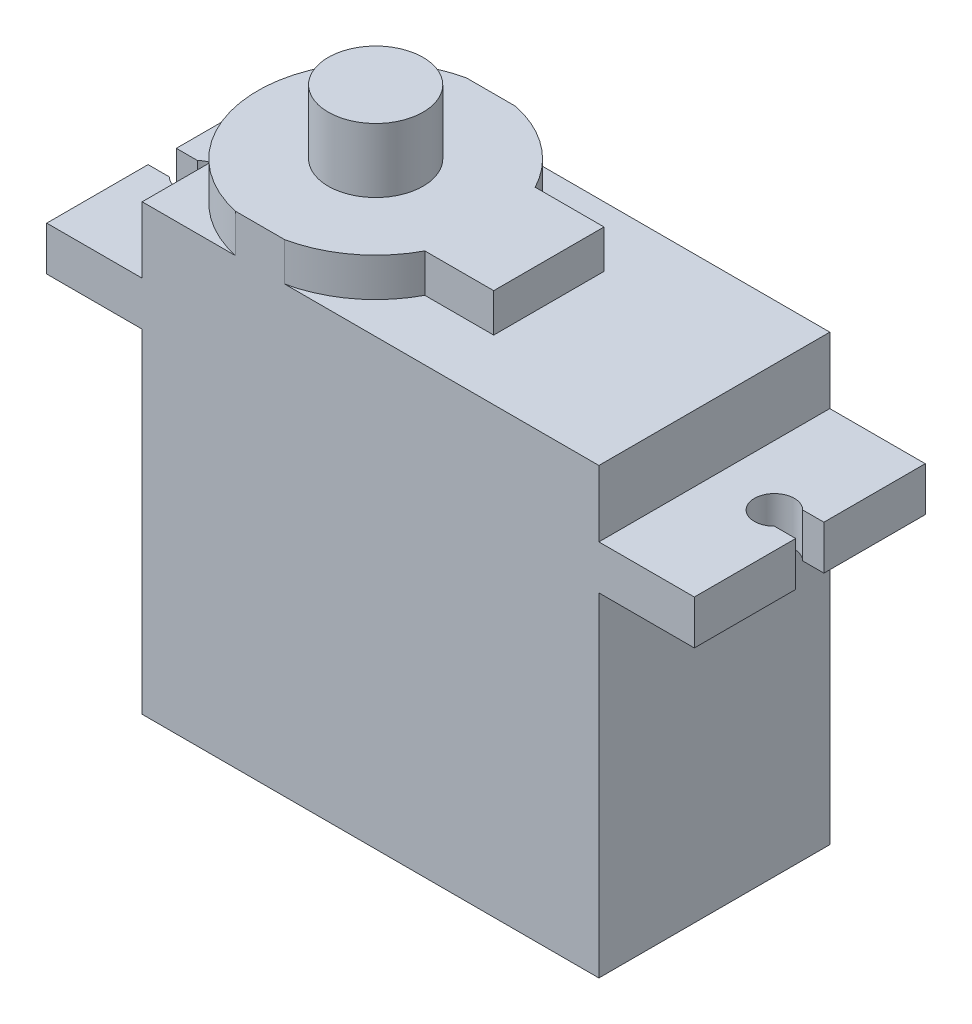
ISO-10303-21;
HEADER;
FILE_DESCRIPTION(('STEP AP214'),'2;1');
FILE_NAME('part.step','',(''),(''),'','','');
FILE_SCHEMA(('AUTOMOTIVE_DESIGN { 1 0 10303 214 1 1 1 1 }'));
ENDSEC;
DATA;
#1=APPLICATION_CONTEXT('core data for automotive mechanical design processes');
#2=APPLICATION_PROTOCOL_DEFINITION('international standard','automotive_design',2000,#1);
#3=PRODUCT_CONTEXT('',#1,'mechanical');
#4=PRODUCT('Part','Part','',(#3));
#5=PRODUCT_RELATED_PRODUCT_CATEGORY('part','',(#4));
#6=PRODUCT_DEFINITION_FORMATION('','',#4);
#7=PRODUCT_DEFINITION_CONTEXT('part definition',#1,'design');
#8=PRODUCT_DEFINITION('design','',#6,#7);
#9=PRODUCT_DEFINITION_SHAPE('','',#8);
#10=(LENGTH_UNIT() NAMED_UNIT(*) SI_UNIT(.MILLI.,.METRE.));
#11=(NAMED_UNIT(*) PLANE_ANGLE_UNIT() SI_UNIT($,.RADIAN.));
#12=(NAMED_UNIT(*) SI_UNIT($,.STERADIAN.) SOLID_ANGLE_UNIT());
#13=UNCERTAINTY_MEASURE_WITH_UNIT(LENGTH_MEASURE(1.E-05),#10,'distance_accuracy_value','');
#14=(GEOMETRIC_REPRESENTATION_CONTEXT(3) GLOBAL_UNCERTAINTY_ASSIGNED_CONTEXT((#13)) GLOBAL_UNIT_ASSIGNED_CONTEXT((#10,
#11,#12)) REPRESENTATION_CONTEXT('',''));
#15=CARTESIAN_POINT('',(0.,0.,0.));
#16=DIRECTION('',(0.,0.,1.));
#17=DIRECTION('',(1.,0.,0.));
#18=AXIS2_PLACEMENT_3D('',#15,#16,#17);
#19=CARTESIAN_POINT('',(22.606,21.971,0.));
#20=DIRECTION('',(-1.,0.,0.));
#21=DIRECTION('',(0.,0.,1.));
#22=AXIS2_PLACEMENT_3D('',#19,#20,#21);
#23=PLANE('',#22);
#24=DIRECTION('',(0.,0.,-1.));
#25=VECTOR('',#24,1.);
#26=CARTESIAN_POINT('',(22.606,16.51,0.));
#27=LINE('',#26,#25);
#28=CARTESIAN_POINT('',(22.606,16.51,0.));
#29=VERTEX_POINT('',#28);
#30=CARTESIAN_POINT('',(22.606,16.51,-11.43));
#31=VERTEX_POINT('',#30);
#32=EDGE_CURVE('E419',#29,#31,#27,.T.);
#33=ORIENTED_EDGE('',*,*,#32,.F.);
#34=DIRECTION('',(0.,-1.,0.));
#35=VECTOR('',#34,1.);
#36=CARTESIAN_POINT('',(22.606,21.971,0.));
#37=LINE('',#36,#35);
#38=CARTESIAN_POINT('',(22.606,0.,0.));
#39=VERTEX_POINT('',#38);
#40=EDGE_CURVE('E251',#29,#39,#37,.T.);
#41=ORIENTED_EDGE('',*,*,#40,.T.);
#42=DIRECTION('',(0.,0.,-1.));
#43=VECTOR('',#42,1.);
#44=CARTESIAN_POINT('',(22.606,0.,0.));
#45=LINE('',#44,#43);
#46=CARTESIAN_POINT('',(22.606,0.,-11.43));
#47=VERTEX_POINT('',#46);
#48=EDGE_CURVE('E282',#39,#47,#45,.T.);
#49=ORIENTED_EDGE('',*,*,#48,.T.);
#50=DIRECTION('',(0.,-1.,0.));
#51=VECTOR('',#50,1.);
#52=CARTESIAN_POINT('',(22.606,21.971,-11.43));
#53=LINE('',#52,#51);
#54=EDGE_CURVE('E258',#31,#47,#53,.T.);
#55=ORIENTED_EDGE('',*,*,#54,.F.);
#56=EDGE_LOOP('',(#33,#41,#49,#55));
#57=FACE_BOUND('',#56,.T.);
#58=ADVANCED_FACE('F36',(#57),#23,.F.);
#59=CARTESIAN_POINT('',(5.842,23.876,-5.715));
#60=DIRECTION('',(0.,1.,0.));
#61=DIRECTION('',(0.,0.,1.));
#62=AXIS2_PLACEMENT_3D('',#59,#60,#61);
#63=PLANE('',#62);
#64=CARTESIAN_POINT('',(5.842,23.876,-5.715));
#65=DIRECTION('',(0.,1.,0.));
#66=DIRECTION('',(0.,0.,1.));
#67=AXIS2_PLACEMENT_3D('',#64,#65,#66);
#68=CIRCLE('',#67,5.842);
#69=CARTESIAN_POINT('',(4.63049721420047,23.876,-11.43));
#70=VERTEX_POINT('',#69);
#71=CARTESIAN_POINT('',(4.63049721420046,23.876,0.));
#72=VERTEX_POINT('',#71);
#73=EDGE_CURVE('E466',#70,#72,#68,.T.);
#74=ORIENTED_EDGE('',*,*,#73,.T.);
#75=DIRECTION('',(1.,0.,0.));
#76=VECTOR('',#75,1.);
#77=CARTESIAN_POINT('',(4.63049721420046,23.876,0.));
#78=LINE('',#77,#76);
#79=CARTESIAN_POINT('',(7.05350278579953,23.876,0.));
#80=VERTEX_POINT('',#79);
#81=EDGE_CURVE('E469',#72,#80,#78,.T.);
#82=ORIENTED_EDGE('',*,*,#81,.T.);
#83=CARTESIAN_POINT('',(5.842,23.876,-5.715));
#84=DIRECTION('',(0.,1.,0.));
#85=DIRECTION('',(0.,0.,1.));
#86=AXIS2_PLACEMENT_3D('',#83,#84,#85);
#87=CIRCLE('',#86,5.842);
#88=CARTESIAN_POINT('',(11.0066232921676,23.876,-2.9845));
#89=VERTEX_POINT('',#88);
#90=EDGE_CURVE('E471',#80,#89,#87,.T.);
#91=ORIENTED_EDGE('',*,*,#90,.T.);
#92=DIRECTION('',(1.,0.,0.));
#93=VECTOR('',#92,1.);
#94=CARTESIAN_POINT('',(11.0066232921676,23.876,-2.9845));
#95=LINE('',#94,#93);
#96=CARTESIAN_POINT('',(14.4145,23.876,-2.9845));
#97=VERTEX_POINT('',#96);
#98=EDGE_CURVE('E473',#89,#97,#95,.T.);
#99=ORIENTED_EDGE('',*,*,#98,.T.);
#100=DIRECTION('',(0.,0.,-1.));
#101=VECTOR('',#100,1.);
#102=CARTESIAN_POINT('',(14.4145,23.876,-2.9845));
#103=LINE('',#102,#101);
#104=CARTESIAN_POINT('',(14.4145,23.876,-8.4455));
#105=VERTEX_POINT('',#104);
#106=EDGE_CURVE('E475',#97,#105,#103,.T.);
#107=ORIENTED_EDGE('',*,*,#106,.T.);
#108=DIRECTION('',(-1.,0.,0.));
#109=VECTOR('',#108,1.);
#110=CARTESIAN_POINT('',(11.0066232921676,23.876,-8.4455));
#111=LINE('',#110,#109);
#112=CARTESIAN_POINT('',(11.0066232921676,23.876,-8.4455));
#113=VERTEX_POINT('',#112);
#114=EDGE_CURVE('E477',#105,#113,#111,.T.);
#115=ORIENTED_EDGE('',*,*,#114,.T.);
#116=CARTESIAN_POINT('',(5.842,23.876,-5.715));
#117=DIRECTION('',(0.,1.,0.));
#118=DIRECTION('',(0.,0.,1.));
#119=AXIS2_PLACEMENT_3D('',#116,#117,#118);
#120=CIRCLE('',#119,5.842);
#121=CARTESIAN_POINT('',(7.05350278579953,23.876,-11.43));
#122=VERTEX_POINT('',#121);
#123=EDGE_CURVE('E479',#113,#122,#120,.T.);
#124=ORIENTED_EDGE('',*,*,#123,.T.);
#125=DIRECTION('',(-1.,0.,0.));
#126=VECTOR('',#125,1.);
#127=CARTESIAN_POINT('',(4.63049721420047,23.876,-11.43));
#128=LINE('',#127,#126);
#129=EDGE_CURVE('E481',#122,#70,#128,.T.);
#130=ORIENTED_EDGE('',*,*,#129,.T.);
#131=EDGE_LOOP('',(#74,#82,#91,#99,#107,#115,#124,#130));
#132=FACE_BOUND('',#131,.T.);
#133=CARTESIAN_POINT('',(5.842,23.876,-5.715));
#134=DIRECTION('',(0.,1.,0.));
#135=DIRECTION('',(0.,0.,1.));
#136=AXIS2_PLACEMENT_3D('',#133,#134,#135);
#137=CIRCLE('',#136,2.3495);
#138=CARTESIAN_POINT('',(5.842,23.876,-3.3655));
#139=VERTEX_POINT('',#138);
#140=EDGE_CURVE('E459',#139,#139,#137,.T.);
#141=ORIENTED_EDGE('',*,*,#140,.F.);
#142=EDGE_LOOP('',(#141));
#143=FACE_BOUND('',#142,.T.);
#144=ADVANCED_FACE('F550',(#132,#143),#63,.T.);
#145=CARTESIAN_POINT('',(0.,21.971,0.));
#146=DIRECTION('',(0.,-1.,0.));
#147=DIRECTION('',(0.,0.,-1.));
#148=AXIS2_PLACEMENT_3D('',#145,#146,#147);
#149=PLANE('',#148);
#150=CARTESIAN_POINT('',(5.842,21.971,-5.715));
#151=DIRECTION('',(0.,1.,0.));
#152=DIRECTION('',(0.,0.,1.));
#153=AXIS2_PLACEMENT_3D('',#150,#151,#152);
#154=CIRCLE('',#153,5.842);
#155=CARTESIAN_POINT('',(4.63049721420047,21.971,-11.43));
#156=VERTEX_POINT('',#155);
#157=CARTESIAN_POINT('',(0.,21.971,-5.715));
#158=VERTEX_POINT('',#157);
#159=EDGE_CURVE('E463',#156,#158,#154,.T.);
#160=ORIENTED_EDGE('',*,*,#159,.F.);
#161=DIRECTION('',(-1.,0.,0.));
#162=VECTOR('',#161,1.);
#163=CARTESIAN_POINT('',(0.,21.971,-11.43));
#164=LINE('',#163,#162);
#165=CARTESIAN_POINT('',(0.,21.971,-11.43));
#166=VERTEX_POINT('',#165);
#167=EDGE_CURVE('E296',#156,#166,#164,.T.);
#168=ORIENTED_EDGE('',*,*,#167,.T.);
#169=DIRECTION('',(0.,0.,1.));
#170=VECTOR('',#169,1.);
#171=CARTESIAN_POINT('',(0.,21.971,0.));
#172=LINE('',#171,#170);
#173=EDGE_CURVE('E303',#166,#158,#172,.T.);
#174=ORIENTED_EDGE('',*,*,#173,.T.);
#175=EDGE_LOOP('',(#160,#168,#174));
#176=FACE_BOUND('',#175,.T.);
#177=ADVANCED_FACE('F569',(#176),#149,.F.);
#178=CARTESIAN_POINT('',(4.63049721420047,21.971,0.));
#179=VERTEX_POINT('',#178);
#180=EDGE_CURVE('E11',#158,#179,#154,.T.);
#181=ORIENTED_EDGE('',*,*,#180,.F.);
#182=CARTESIAN_POINT('',(0.,21.971,0.));
#183=VERTEX_POINT('',#182);
#184=EDGE_CURVE('E281',#158,#183,#172,.T.);
#185=ORIENTED_EDGE('',*,*,#184,.T.);
#186=DIRECTION('',(1.,0.,0.));
#187=VECTOR('',#186,1.);
#188=CARTESIAN_POINT('',(0.,21.971,0.));
#189=LINE('',#188,#187);
#190=EDGE_CURVE('E302',#183,#179,#189,.T.);
#191=ORIENTED_EDGE('',*,*,#190,.T.);
#192=EDGE_LOOP('',(#181,#185,#191));
#193=FACE_BOUND('',#192,.T.);
#194=ADVANCED_FACE('F589',(#193),#149,.F.);
#195=CARTESIAN_POINT('',(5.842,21.971,-5.715));
#196=DIRECTION('',(0.,1.,0.));
#197=DIRECTION('',(0.,0.,1.));
#198=AXIS2_PLACEMENT_3D('',#195,#196,#197);
#199=CIRCLE('',#198,5.842);
#200=CARTESIAN_POINT('',(11.0066232921676,21.971,-8.4455));
#201=VERTEX_POINT('',#200);
#202=CARTESIAN_POINT('',(7.05350278579952,21.971,-11.43));
#203=VERTEX_POINT('',#202);
#204=EDGE_CURVE('E61',#201,#203,#199,.T.);
#205=ORIENTED_EDGE('',*,*,#204,.F.);
#206=DIRECTION('',(-1.,0.,0.));
#207=VECTOR('',#206,1.);
#208=CARTESIAN_POINT('',(11.0066232921676,21.971,-8.4455));
#209=LINE('',#208,#207);
#210=CARTESIAN_POINT('',(14.4145,21.971,-8.4455));
#211=VERTEX_POINT('',#210);
#212=EDGE_CURVE('E504',#211,#201,#209,.T.);
#213=ORIENTED_EDGE('',*,*,#212,.F.);
#214=DIRECTION('',(0.,0.,-1.));
#215=VECTOR('',#214,1.);
#216=CARTESIAN_POINT('',(14.4145,21.971,-2.9845));
#217=LINE('',#216,#215);
#218=CARTESIAN_POINT('',(14.4145,21.971,-2.9845));
#219=VERTEX_POINT('',#218);
#220=EDGE_CURVE('E537',#219,#211,#217,.T.);
#221=ORIENTED_EDGE('',*,*,#220,.F.);
#222=DIRECTION('',(1.,0.,0.));
#223=VECTOR('',#222,1.);
#224=CARTESIAN_POINT('',(11.0066232921676,21.971,-2.9845));
#225=LINE('',#224,#223);
#226=CARTESIAN_POINT('',(11.0066232921676,21.971,-2.9845));
#227=VERTEX_POINT('',#226);
#228=EDGE_CURVE('E486',#227,#219,#225,.T.);
#229=ORIENTED_EDGE('',*,*,#228,.F.);
#230=CARTESIAN_POINT('',(5.842,21.971,-5.715));
#231=DIRECTION('',(0.,1.,0.));
#232=DIRECTION('',(0.,0.,1.));
#233=AXIS2_PLACEMENT_3D('',#230,#231,#232);
#234=CIRCLE('',#233,5.842);
#235=CARTESIAN_POINT('',(7.05350278579952,21.971,0.));
#236=VERTEX_POINT('',#235);
#237=EDGE_CURVE('E494',#236,#227,#234,.T.);
#238=ORIENTED_EDGE('',*,*,#237,.F.);
#239=CARTESIAN_POINT('',(22.606,21.971,0.));
#240=VERTEX_POINT('',#239);
#241=EDGE_CURVE('E300',#236,#240,#189,.T.);
#242=ORIENTED_EDGE('',*,*,#241,.T.);
#243=DIRECTION('',(0.,0.,-1.));
#244=VECTOR('',#243,1.);
#245=CARTESIAN_POINT('',(22.606,21.971,0.));
#246=LINE('',#245,#244);
#247=CARTESIAN_POINT('',(22.606,21.971,-11.43));
#248=VERTEX_POINT('',#247);
#249=EDGE_CURVE('E249',#240,#248,#246,.T.);
#250=ORIENTED_EDGE('',*,*,#249,.T.);
#251=EDGE_CURVE('E298',#248,#203,#164,.T.);
#252=ORIENTED_EDGE('',*,*,#251,.T.);
#253=EDGE_LOOP('',(#205,#213,#221,#229,#238,#242,#250,#252));
#254=FACE_BOUND('',#253,.T.);
#255=ADVANCED_FACE('F584',(#254),#149,.F.);
#256=CARTESIAN_POINT('',(0.,21.971,0.));
#257=DIRECTION('',(1.,0.,0.));
#258=DIRECTION('',(0.,0.,-1.));
#259=AXIS2_PLACEMENT_3D('',#256,#257,#258);
#260=PLANE('',#259);
#261=DIRECTION('',(0.,0.,-1.));
#262=VECTOR('',#261,1.);
#263=CARTESIAN_POINT('',(0.,18.6944,0.));
#264=LINE('',#263,#262);
#265=CARTESIAN_POINT('',(0.,18.6944,0.));
#266=VERTEX_POINT('',#265);
#267=CARTESIAN_POINT('',(0.,18.6944,-11.43));
#268=VERTEX_POINT('',#267);
#269=EDGE_CURVE('E393',#266,#268,#264,.T.);
#270=ORIENTED_EDGE('',*,*,#269,.F.);
#271=DIRECTION('',(0.,-1.,0.));
#272=VECTOR('',#271,1.);
#273=CARTESIAN_POINT('',(0.,21.971,0.));
#274=LINE('',#273,#272);
#275=EDGE_CURVE('E45',#183,#266,#274,.T.);
#276=ORIENTED_EDGE('',*,*,#275,.F.);
#277=ORIENTED_EDGE('',*,*,#184,.F.);
#278=ORIENTED_EDGE('',*,*,#173,.F.);
#279=DIRECTION('',(0.,-1.,0.));
#280=VECTOR('',#279,1.);
#281=CARTESIAN_POINT('',(0.,21.971,-11.43));
#282=LINE('',#281,#280);
#283=EDGE_CURVE('E271',#166,#268,#282,.T.);
#284=ORIENTED_EDGE('',*,*,#283,.T.);
#285=EDGE_LOOP('',(#270,#276,#277,#278,#284));
#286=FACE_BOUND('',#285,.T.);
#287=ADVANCED_FACE('F580',(#286),#260,.F.);
#288=CARTESIAN_POINT('',(0.,16.51,0.));
#289=VERTEX_POINT('',#288);
#290=CARTESIAN_POINT('',(0.,0.,0.));
#291=VERTEX_POINT('',#290);
#292=EDGE_CURVE('E250',#289,#291,#274,.T.);
#293=ORIENTED_EDGE('',*,*,#292,.F.);
#294=DIRECTION('',(0.,0.,-1.));
#295=VECTOR('',#294,1.);
#296=CARTESIAN_POINT('',(0.,16.51,0.));
#297=LINE('',#296,#295);
#298=CARTESIAN_POINT('',(0.,16.51,-11.43));
#299=VERTEX_POINT('',#298);
#300=EDGE_CURVE('E345',#289,#299,#297,.T.);
#301=ORIENTED_EDGE('',*,*,#300,.T.);
#302=CARTESIAN_POINT('',(0.,0.,-11.43));
#303=VERTEX_POINT('',#302);
#304=EDGE_CURVE('E273',#299,#303,#282,.T.);
#305=ORIENTED_EDGE('',*,*,#304,.T.);
#306=DIRECTION('',(0.,0.,1.));
#307=VECTOR('',#306,1.);
#308=CARTESIAN_POINT('',(0.,0.,0.));
#309=LINE('',#308,#307);
#310=EDGE_CURVE('E287',#303,#291,#309,.T.);
#311=ORIENTED_EDGE('',*,*,#310,.T.);
#312=EDGE_LOOP('',(#293,#301,#305,#311));
#313=FACE_BOUND('',#312,.T.);
#314=ADVANCED_FACE('F38',(#313),#260,.F.);
#315=CARTESIAN_POINT('',(0.,21.971,0.));
#316=DIRECTION('',(0.,0.,-1.));
#317=DIRECTION('',(-1.,0.,0.));
#318=AXIS2_PLACEMENT_3D('',#315,#316,#317);
#319=PLANE('',#318);
#320=DIRECTION('',(1.,0.,0.));
#321=VECTOR('',#320,1.);
#322=CARTESIAN_POINT('',(0.,0.,0.));
#323=LINE('',#322,#321);
#324=EDGE_CURVE('E285',#291,#39,#323,.T.);
#325=ORIENTED_EDGE('',*,*,#324,.T.);
#326=ORIENTED_EDGE('',*,*,#40,.F.);
#327=DIRECTION('',(-1.,0.,0.));
#328=VECTOR('',#327,1.);
#329=CARTESIAN_POINT('',(22.606,16.51,0.));
#330=LINE('',#329,#328);
#331=CARTESIAN_POINT('',(27.3304,16.51,0.));
#332=VERTEX_POINT('',#331);
#333=EDGE_CURVE('E414',#332,#29,#330,.T.);
#334=ORIENTED_EDGE('',*,*,#333,.F.);
#335=DIRECTION('',(0.,-1.,0.));
#336=VECTOR('',#335,1.);
#337=CARTESIAN_POINT('',(27.3304,18.6944,0.));
#338=LINE('',#337,#336);
#339=CARTESIAN_POINT('',(27.3304,18.6944,0.));
#340=VERTEX_POINT('',#339);
#341=EDGE_CURVE('E245',#340,#332,#338,.T.);
#342=ORIENTED_EDGE('',*,*,#341,.F.);
#343=DIRECTION('',(-1.,0.,0.));
#344=VECTOR('',#343,1.);
#345=CARTESIAN_POINT('',(22.606,18.6944,0.));
#346=LINE('',#345,#344);
#347=CARTESIAN_POINT('',(22.606,18.6944,0.));
#348=VERTEX_POINT('',#347);
#349=EDGE_CURVE('E229',#340,#348,#346,.T.);
#350=ORIENTED_EDGE('',*,*,#349,.T.);
#351=EDGE_CURVE('E242',#240,#348,#37,.T.);
#352=ORIENTED_EDGE('',*,*,#351,.F.);
#353=ORIENTED_EDGE('',*,*,#241,.F.);
#354=DIRECTION('',(0.,-1.,0.));
#355=VECTOR('',#354,1.);
#356=CARTESIAN_POINT('',(7.05350278579953,23.876,0.));
#357=LINE('',#356,#355);
#358=EDGE_CURVE('E521',#80,#236,#357,.T.);
#359=ORIENTED_EDGE('',*,*,#358,.F.);
#360=ORIENTED_EDGE('',*,*,#81,.F.);
#361=DIRECTION('',(0.,-1.,0.));
#362=VECTOR('',#361,1.);
#363=CARTESIAN_POINT('',(4.63049721420046,23.876,0.));
#364=LINE('',#363,#362);
#365=EDGE_CURVE('E348',#72,#179,#364,.T.);
#366=ORIENTED_EDGE('',*,*,#365,.T.);
#367=ORIENTED_EDGE('',*,*,#190,.F.);
#368=ORIENTED_EDGE('',*,*,#275,.T.);
#369=DIRECTION('',(1.,0.,0.));
#370=VECTOR('',#369,1.);
#371=CARTESIAN_POINT('',(0.,18.6944,0.));
#372=LINE('',#371,#370);
#373=CARTESIAN_POINT('',(-4.7244,18.6944,0.));
#374=VERTEX_POINT('',#373);
#375=EDGE_CURVE('E327',#374,#266,#372,.T.);
#376=ORIENTED_EDGE('',*,*,#375,.F.);
#377=DIRECTION('',(0.,-1.,0.));
#378=VECTOR('',#377,1.);
#379=CARTESIAN_POINT('',(-4.7244,18.6944,0.));
#380=LINE('',#379,#378);
#381=CARTESIAN_POINT('',(-4.7244,16.51,0.));
#382=VERTEX_POINT('',#381);
#383=EDGE_CURVE('E324',#374,#382,#380,.T.);
#384=ORIENTED_EDGE('',*,*,#383,.T.);
#385=DIRECTION('',(1.,0.,0.));
#386=VECTOR('',#385,1.);
#387=CARTESIAN_POINT('',(0.,16.51,0.));
#388=LINE('',#387,#386);
#389=EDGE_CURVE('E330',#382,#289,#388,.T.);
#390=ORIENTED_EDGE('',*,*,#389,.T.);
#391=ORIENTED_EDGE('',*,*,#292,.T.);
#392=EDGE_LOOP('',(#325,#326,#334,#342,#350,#352,#353,#359,#360,#366,#367,#368,#376,#384,#390,#391));
#393=FACE_BOUND('',#392,.T.);
#394=ADVANCED_FACE('F240',(#393),#319,.F.);
#395=ORIENTED_EDGE('',*,*,#351,.T.);
#396=DIRECTION('',(0.,0.,-1.));
#397=VECTOR('',#396,1.);
#398=CARTESIAN_POINT('',(22.606,18.6944,0.));
#399=LINE('',#398,#397);
#400=CARTESIAN_POINT('',(22.606,18.6944,-11.43));
#401=VERTEX_POINT('',#400);
#402=EDGE_CURVE('E225',#348,#401,#399,.T.);
#403=ORIENTED_EDGE('',*,*,#402,.T.);
#404=EDGE_CURVE('E254',#248,#401,#53,.T.);
#405=ORIENTED_EDGE('',*,*,#404,.F.);
#406=ORIENTED_EDGE('',*,*,#249,.F.);
#407=EDGE_LOOP('',(#395,#403,#405,#406));
#408=FACE_BOUND('',#407,.T.);
#409=ADVANCED_FACE('F248',(#408),#23,.F.);
#410=CARTESIAN_POINT('',(0.,21.971,-11.43));
#411=DIRECTION('',(0.,0.,1.));
#412=DIRECTION('',(1.,0.,0.));
#413=AXIS2_PLACEMENT_3D('',#410,#411,#412);
#414=PLANE('',#413);
#415=DIRECTION('',(-1.,0.,0.));
#416=VECTOR('',#415,1.);
#417=CARTESIAN_POINT('',(0.,0.,-11.43));
#418=LINE('',#417,#416);
#419=EDGE_CURVE('E277',#47,#303,#418,.T.);
#420=ORIENTED_EDGE('',*,*,#419,.T.);
#421=ORIENTED_EDGE('',*,*,#304,.F.);
#422=DIRECTION('',(-1.,0.,0.));
#423=VECTOR('',#422,1.);
#424=CARTESIAN_POINT('',(0.,16.51,-11.43));
#425=LINE('',#424,#423);
#426=CARTESIAN_POINT('',(-4.7244,16.51,-11.43));
#427=VERTEX_POINT('',#426);
#428=EDGE_CURVE('E339',#299,#427,#425,.T.);
#429=ORIENTED_EDGE('',*,*,#428,.T.);
#430=DIRECTION('',(0.,-1.,0.));
#431=VECTOR('',#430,1.);
#432=CARTESIAN_POINT('',(-4.7244,18.6944,-11.43));
#433=LINE('',#432,#431);
#434=CARTESIAN_POINT('',(-4.7244,18.6944,-11.43));
#435=VERTEX_POINT('',#434);
#436=EDGE_CURVE('E290',#435,#427,#433,.T.);
#437=ORIENTED_EDGE('',*,*,#436,.F.);
#438=DIRECTION('',(-1.,0.,0.));
#439=VECTOR('',#438,1.);
#440=CARTESIAN_POINT('',(0.,18.6944,-11.43));
#441=LINE('',#440,#439);
#442=EDGE_CURVE('E387',#268,#435,#441,.T.);
#443=ORIENTED_EDGE('',*,*,#442,.F.);
#444=ORIENTED_EDGE('',*,*,#283,.F.);
#445=ORIENTED_EDGE('',*,*,#167,.F.);
#446=DIRECTION('',(0.,-1.,0.));
#447=VECTOR('',#446,1.);
#448=CARTESIAN_POINT('',(4.63049721420047,23.876,-11.43));
#449=LINE('',#448,#447);
#450=EDGE_CURVE('E483',#70,#156,#449,.T.);
#451=ORIENTED_EDGE('',*,*,#450,.F.);
#452=ORIENTED_EDGE('',*,*,#129,.F.);
#453=DIRECTION('',(0.,-1.,0.));
#454=VECTOR('',#453,1.);
#455=CARTESIAN_POINT('',(7.05350278579953,23.876,-11.43));
#456=LINE('',#455,#454);
#457=EDGE_CURVE('E499',#122,#203,#456,.T.);
#458=ORIENTED_EDGE('',*,*,#457,.T.);
#459=ORIENTED_EDGE('',*,*,#251,.F.);
#460=ORIENTED_EDGE('',*,*,#404,.T.);
#461=DIRECTION('',(1.,0.,0.));
#462=VECTOR('',#461,1.);
#463=CARTESIAN_POINT('',(22.606,18.6944,-11.43));
#464=LINE('',#463,#462);
#465=CARTESIAN_POINT('',(27.3304,18.6944,-11.43));
#466=VERTEX_POINT('',#465);
#467=EDGE_CURVE('E53',#401,#466,#464,.T.);
#468=ORIENTED_EDGE('',*,*,#467,.T.);
#469=DIRECTION('',(0.,-1.,0.));
#470=VECTOR('',#469,1.);
#471=CARTESIAN_POINT('',(27.3304,18.6944,-11.43));
#472=LINE('',#471,#470);
#473=CARTESIAN_POINT('',(27.3304,16.51,-11.43));
#474=VERTEX_POINT('',#473);
#475=EDGE_CURVE('E448',#466,#474,#472,.T.);
#476=ORIENTED_EDGE('',*,*,#475,.T.);
#477=DIRECTION('',(1.,0.,0.));
#478=VECTOR('',#477,1.);
#479=CARTESIAN_POINT('',(22.606,16.51,-11.43));
#480=LINE('',#479,#478);
#481=EDGE_CURVE('E235',#31,#474,#480,.T.);
#482=ORIENTED_EDGE('',*,*,#481,.F.);
#483=ORIENTED_EDGE('',*,*,#54,.T.);
#484=EDGE_LOOP('',(#420,#421,#429,#437,#443,#444,#445,#451,#452,#458,#459,#460,#468,#476,#482,#483));
#485=FACE_BOUND('',#484,.T.);
#486=ADVANCED_FACE('F356',(#485),#414,.F.);
#487=CARTESIAN_POINT('',(0.,0.,0.));
#488=DIRECTION('',(0.,-1.,0.));
#489=DIRECTION('',(0.,0.,-1.));
#490=AXIS2_PLACEMENT_3D('',#487,#488,#489);
#491=PLANE('',#490);
#492=ORIENTED_EDGE('',*,*,#310,.F.);
#493=ORIENTED_EDGE('',*,*,#419,.F.);
#494=ORIENTED_EDGE('',*,*,#48,.F.);
#495=ORIENTED_EDGE('',*,*,#324,.F.);
#496=EDGE_LOOP('',(#492,#493,#494,#495));
#497=FACE_BOUND('',#496,.T.);
#498=ADVANCED_FACE('F411',(#497),#491,.T.);
#499=CARTESIAN_POINT('',(-4.7244,18.6944,-6.4135));
#500=DIRECTION('',(1.,0.,0.));
#501=DIRECTION('',(0.,0.,-1.));
#502=AXIS2_PLACEMENT_3D('',#499,#500,#501);
#503=PLANE('',#502);
#504=DIRECTION('',(0.,0.,1.));
#505=VECTOR('',#504,1.);
#506=CARTESIAN_POINT('',(-4.7244,16.51,-6.4135));
#507=LINE('',#506,#505);
#508=CARTESIAN_POINT('',(-4.7244,16.51,-6.4135));
#509=VERTEX_POINT('',#508);
#510=EDGE_CURVE('E337',#427,#509,#507,.T.);
#511=ORIENTED_EDGE('',*,*,#510,.T.);
#512=DIRECTION('',(0.,-1.,0.));
#513=VECTOR('',#512,1.);
#514=CARTESIAN_POINT('',(-4.7244,18.6944,-6.4135));
#515=LINE('',#514,#513);
#516=CARTESIAN_POINT('',(-4.7244,18.6944,-6.4135));
#517=VERTEX_POINT('',#516);
#518=EDGE_CURVE('E312',#517,#509,#515,.T.);
#519=ORIENTED_EDGE('',*,*,#518,.F.);
#520=DIRECTION('',(0.,0.,1.));
#521=VECTOR('',#520,1.);
#522=CARTESIAN_POINT('',(-4.7244,18.6944,-6.4135));
#523=LINE('',#522,#521);
#524=EDGE_CURVE('E365',#435,#517,#523,.T.);
#525=ORIENTED_EDGE('',*,*,#524,.F.);
#526=ORIENTED_EDGE('',*,*,#436,.T.);
#527=EDGE_LOOP('',(#511,#519,#525,#526));
#528=FACE_BOUND('',#527,.T.);
#529=ADVANCED_FACE('F363',(#528),#503,.F.);
#530=CARTESIAN_POINT('',(-3.67421448589846,18.6944,-6.4135));
#531=DIRECTION('',(0.,0.,-1.));
#532=DIRECTION('',(-1.,0.,0.));
#533=AXIS2_PLACEMENT_3D('',#530,#531,#532);
#534=PLANE('',#533);
#535=DIRECTION('',(1.,0.,0.));
#536=VECTOR('',#535,1.);
#537=CARTESIAN_POINT('',(-3.67421448589846,16.51,-6.4135));
#538=LINE('',#537,#536);
#539=CARTESIAN_POINT('',(-3.67421448589846,16.51,-6.4135));
#540=VERTEX_POINT('',#539);
#541=EDGE_CURVE('E335',#509,#540,#538,.T.);
#542=ORIENTED_EDGE('',*,*,#541,.T.);
#543=DIRECTION('',(0.,-1.,0.));
#544=VECTOR('',#543,1.);
#545=CARTESIAN_POINT('',(-3.67421448589846,18.6944,-6.4135));
#546=LINE('',#545,#544);
#547=CARTESIAN_POINT('',(-3.67421448589846,18.6944,-6.4135));
#548=VERTEX_POINT('',#547);
#549=EDGE_CURVE('E315',#548,#540,#546,.T.);
#550=ORIENTED_EDGE('',*,*,#549,.F.);
#551=DIRECTION('',(1.,0.,0.));
#552=VECTOR('',#551,1.);
#553=CARTESIAN_POINT('',(-3.67421448589846,18.6944,-6.4135));
#554=LINE('',#553,#552);
#555=EDGE_CURVE('E382',#517,#548,#554,.T.);
#556=ORIENTED_EDGE('',*,*,#555,.F.);
#557=ORIENTED_EDGE('',*,*,#518,.T.);
#558=EDGE_LOOP('',(#542,#550,#556,#557));
#559=FACE_BOUND('',#558,.T.);
#560=ADVANCED_FACE('F372',(#559),#534,.F.);
#561=CARTESIAN_POINT('',(-2.9718,18.6944,-5.715));
#562=DIRECTION('',(0.,-1.,0.));
#563=DIRECTION('',(0.,0.,-1.));
#564=AXIS2_PLACEMENT_3D('',#561,#562,#563);
#565=CYLINDRICAL_SURFACE('',#564,0.9906);
#566=CARTESIAN_POINT('',(-2.9718,16.51,-5.715));
#567=DIRECTION('',(0.,-1.,0.));
#568=DIRECTION('',(0.,0.,1.));
#569=AXIS2_PLACEMENT_3D('',#566,#567,#568);
#570=CIRCLE('',#569,0.9906);
#571=CARTESIAN_POINT('',(-3.67421448589846,16.51,-5.0165));
#572=VERTEX_POINT('',#571);
#573=EDGE_CURVE('E333',#540,#572,#570,.T.);
#574=ORIENTED_EDGE('',*,*,#573,.T.);
#575=DIRECTION('',(0.,-1.,0.));
#576=VECTOR('',#575,1.);
#577=CARTESIAN_POINT('',(-3.67421448589846,18.6944,-5.0165));
#578=LINE('',#577,#576);
#579=CARTESIAN_POINT('',(-3.67421448589846,18.6944,-5.0165));
#580=VERTEX_POINT('',#579);
#581=EDGE_CURVE('E318',#580,#572,#578,.T.);
#582=ORIENTED_EDGE('',*,*,#581,.F.);
#583=CARTESIAN_POINT('',(-2.9718,18.6944,-5.715));
#584=DIRECTION('',(0.,-1.,0.));
#585=DIRECTION('',(0.,0.,1.));
#586=AXIS2_PLACEMENT_3D('',#583,#584,#585);
#587=CIRCLE('',#586,0.9906);
#588=EDGE_CURVE('E378',#548,#580,#587,.T.);
#589=ORIENTED_EDGE('',*,*,#588,.F.);
#590=ORIENTED_EDGE('',*,*,#549,.T.);
#591=EDGE_LOOP('',(#574,#582,#589,#590));
#592=FACE_BOUND('',#591,.T.);
#593=ADVANCED_FACE('F376',(#592),#565,.F.);
#594=CARTESIAN_POINT('',(-3.67421448589846,18.6944,-5.0165));
#595=DIRECTION('',(0.,0.,1.));
#596=DIRECTION('',(1.,0.,0.));
#597=AXIS2_PLACEMENT_3D('',#594,#595,#596);
#598=PLANE('',#597);
#599=DIRECTION('',(-1.,0.,0.));
#600=VECTOR('',#599,1.);
#601=CARTESIAN_POINT('',(-3.67421448589846,16.51,-5.0165));
#602=LINE('',#601,#600);
#603=CARTESIAN_POINT('',(-4.7244,16.51,-5.0165));
#604=VERTEX_POINT('',#603);
#605=EDGE_CURVE('E331',#572,#604,#602,.T.);
#606=ORIENTED_EDGE('',*,*,#605,.T.);
#607=DIRECTION('',(0.,-1.,0.));
#608=VECTOR('',#607,1.);
#609=CARTESIAN_POINT('',(-4.7244,18.6944,-5.0165));
#610=LINE('',#609,#608);
#611=CARTESIAN_POINT('',(-4.7244,18.6944,-5.0165));
#612=VERTEX_POINT('',#611);
#613=EDGE_CURVE('E321',#612,#604,#610,.T.);
#614=ORIENTED_EDGE('',*,*,#613,.F.);
#615=DIRECTION('',(-1.,0.,0.));
#616=VECTOR('',#615,1.);
#617=CARTESIAN_POINT('',(-3.67421448589846,18.6944,-5.0165));
#618=LINE('',#617,#616);
#619=EDGE_CURVE('E381',#580,#612,#618,.T.);
#620=ORIENTED_EDGE('',*,*,#619,.F.);
#621=ORIENTED_EDGE('',*,*,#581,.T.);
#622=EDGE_LOOP('',(#606,#614,#620,#621));
#623=FACE_BOUND('',#622,.T.);
#624=ADVANCED_FACE('F603',(#623),#598,.F.);
#625=CARTESIAN_POINT('',(-4.7244,18.6944,0.));
#626=DIRECTION('',(1.,0.,0.));
#627=DIRECTION('',(0.,0.,-1.));
#628=AXIS2_PLACEMENT_3D('',#625,#626,#627);
#629=PLANE('',#628);
#630=DIRECTION('',(0.,0.,1.));
#631=VECTOR('',#630,1.);
#632=CARTESIAN_POINT('',(-4.7244,16.51,0.));
#633=LINE('',#632,#631);
#634=EDGE_CURVE('E328',#604,#382,#633,.T.);
#635=ORIENTED_EDGE('',*,*,#634,.T.);
#636=ORIENTED_EDGE('',*,*,#383,.F.);
#637=DIRECTION('',(0.,0.,1.));
#638=VECTOR('',#637,1.);
#639=CARTESIAN_POINT('',(-4.7244,18.6944,0.));
#640=LINE('',#639,#638);
#641=EDGE_CURVE('E342',#612,#374,#640,.T.);
#642=ORIENTED_EDGE('',*,*,#641,.F.);
#643=ORIENTED_EDGE('',*,*,#613,.T.);
#644=EDGE_LOOP('',(#635,#636,#642,#643));
#645=FACE_BOUND('',#644,.T.);
#646=ADVANCED_FACE('F601',(#645),#629,.F.);
#647=CARTESIAN_POINT('',(-2.9718,18.6944,-5.715));
#648=DIRECTION('',(0.,1.,0.));
#649=DIRECTION('',(0.,0.,1.));
#650=AXIS2_PLACEMENT_3D('',#647,#648,#649);
#651=PLANE('',#650);
#652=ORIENTED_EDGE('',*,*,#269,.T.);
#653=ORIENTED_EDGE('',*,*,#442,.T.);
#654=ORIENTED_EDGE('',*,*,#524,.T.);
#655=ORIENTED_EDGE('',*,*,#555,.T.);
#656=ORIENTED_EDGE('',*,*,#588,.T.);
#657=ORIENTED_EDGE('',*,*,#619,.T.);
#658=ORIENTED_EDGE('',*,*,#641,.T.);
#659=ORIENTED_EDGE('',*,*,#375,.T.);
#660=EDGE_LOOP('',(#652,#653,#654,#655,#656,#657,#658,#659));
#661=FACE_BOUND('',#660,.T.);
#662=ADVANCED_FACE('F597',(#661),#651,.T.);
#663=CARTESIAN_POINT('',(-2.9718,16.51,-5.715));
#664=DIRECTION('',(0.,1.,0.));
#665=DIRECTION('',(0.,0.,1.));
#666=AXIS2_PLACEMENT_3D('',#663,#664,#665);
#667=PLANE('',#666);
#668=ORIENTED_EDGE('',*,*,#300,.F.);
#669=ORIENTED_EDGE('',*,*,#389,.F.);
#670=ORIENTED_EDGE('',*,*,#634,.F.);
#671=ORIENTED_EDGE('',*,*,#605,.F.);
#672=ORIENTED_EDGE('',*,*,#573,.F.);
#673=ORIENTED_EDGE('',*,*,#541,.F.);
#674=ORIENTED_EDGE('',*,*,#510,.F.);
#675=ORIENTED_EDGE('',*,*,#428,.F.);
#676=EDGE_LOOP('',(#668,#669,#670,#671,#672,#673,#674,#675));
#677=FACE_BOUND('',#676,.T.);
#678=ADVANCED_FACE('F367',(#677),#667,.F.);
#679=CARTESIAN_POINT('',(5.842,23.876,-5.715));
#680=DIRECTION('',(0.,-1.,0.));
#681=DIRECTION('',(0.,0.,-1.));
#682=AXIS2_PLACEMENT_3D('',#679,#680,#681);
#683=CYLINDRICAL_SURFACE('',#682,5.842);
#684=ORIENTED_EDGE('',*,*,#159,.T.);
#685=ORIENTED_EDGE('',*,*,#180,.T.);
#686=ORIENTED_EDGE('',*,*,#365,.F.);
#687=ORIENTED_EDGE('',*,*,#73,.F.);
#688=ORIENTED_EDGE('',*,*,#450,.T.);
#689=EDGE_LOOP('',(#684,#685,#686,#687,#688));
#690=FACE_BOUND('',#689,.T.);
#691=ADVANCED_FACE('F664',(#690),#683,.T.);
#692=CARTESIAN_POINT('',(5.842,23.876,-5.715));
#693=DIRECTION('',(0.,-1.,0.));
#694=DIRECTION('',(0.,0.,-1.));
#695=AXIS2_PLACEMENT_3D('',#692,#693,#694);
#696=CYLINDRICAL_SURFACE('',#695,5.842);
#697=ORIENTED_EDGE('',*,*,#237,.T.);
#698=DIRECTION('',(0.,-1.,0.));
#699=VECTOR('',#698,1.);
#700=CARTESIAN_POINT('',(11.0066232921676,23.876,-2.9845));
#701=LINE('',#700,#699);
#702=EDGE_CURVE('E390',#89,#227,#701,.T.);
#703=ORIENTED_EDGE('',*,*,#702,.F.);
#704=ORIENTED_EDGE('',*,*,#90,.F.);
#705=ORIENTED_EDGE('',*,*,#358,.T.);
#706=EDGE_LOOP('',(#697,#703,#704,#705));
#707=FACE_BOUND('',#706,.T.);
#708=ADVANCED_FACE('F562',(#707),#696,.T.);
#709=CARTESIAN_POINT('',(11.0066232921676,23.876,-2.9845));
#710=DIRECTION('',(0.,0.,-1.));
#711=DIRECTION('',(-1.,0.,0.));
#712=AXIS2_PLACEMENT_3D('',#709,#710,#711);
#713=PLANE('',#712);
#714=ORIENTED_EDGE('',*,*,#228,.T.);
#715=DIRECTION('',(0.,-1.,0.));
#716=VECTOR('',#715,1.);
#717=CARTESIAN_POINT('',(14.4145,23.876,-2.9845));
#718=LINE('',#717,#716);
#719=EDGE_CURVE('E514',#97,#219,#718,.T.);
#720=ORIENTED_EDGE('',*,*,#719,.F.);
#721=ORIENTED_EDGE('',*,*,#98,.F.);
#722=ORIENTED_EDGE('',*,*,#702,.T.);
#723=EDGE_LOOP('',(#714,#720,#721,#722));
#724=FACE_BOUND('',#723,.T.);
#725=ADVANCED_FACE('F555',(#724),#713,.F.);
#726=CARTESIAN_POINT('',(14.4145,23.876,-2.9845));
#727=DIRECTION('',(-1.,0.,0.));
#728=DIRECTION('',(0.,0.,1.));
#729=AXIS2_PLACEMENT_3D('',#726,#727,#728);
#730=PLANE('',#729);
#731=ORIENTED_EDGE('',*,*,#220,.T.);
#732=DIRECTION('',(0.,-1.,0.));
#733=VECTOR('',#732,1.);
#734=CARTESIAN_POINT('',(14.4145,23.876,-8.4455));
#735=LINE('',#734,#733);
#736=EDGE_CURVE('E512',#105,#211,#735,.T.);
#737=ORIENTED_EDGE('',*,*,#736,.F.);
#738=ORIENTED_EDGE('',*,*,#106,.F.);
#739=ORIENTED_EDGE('',*,*,#719,.T.);
#740=EDGE_LOOP('',(#731,#737,#738,#739));
#741=FACE_BOUND('',#740,.T.);
#742=ADVANCED_FACE('F553',(#741),#730,.F.);
#743=CARTESIAN_POINT('',(11.0066232921676,23.876,-8.4455));
#744=DIRECTION('',(0.,0.,1.));
#745=DIRECTION('',(1.,0.,0.));
#746=AXIS2_PLACEMENT_3D('',#743,#744,#745);
#747=PLANE('',#746);
#748=ORIENTED_EDGE('',*,*,#212,.T.);
#749=DIRECTION('',(0.,-1.,0.));
#750=VECTOR('',#749,1.);
#751=CARTESIAN_POINT('',(11.0066232921676,23.876,-8.4455));
#752=LINE('',#751,#750);
#753=EDGE_CURVE('E509',#113,#201,#752,.T.);
#754=ORIENTED_EDGE('',*,*,#753,.F.);
#755=ORIENTED_EDGE('',*,*,#114,.F.);
#756=ORIENTED_EDGE('',*,*,#736,.T.);
#757=EDGE_LOOP('',(#748,#754,#755,#756));
#758=FACE_BOUND('',#757,.T.);
#759=ADVANCED_FACE('F541',(#758),#747,.F.);
#760=CARTESIAN_POINT('',(5.842,23.876,-5.715));
#761=DIRECTION('',(0.,-1.,0.));
#762=DIRECTION('',(0.,0.,-1.));
#763=AXIS2_PLACEMENT_3D('',#760,#761,#762);
#764=CYLINDRICAL_SURFACE('',#763,5.842);
#765=ORIENTED_EDGE('',*,*,#204,.T.);
#766=ORIENTED_EDGE('',*,*,#457,.F.);
#767=ORIENTED_EDGE('',*,*,#123,.F.);
#768=ORIENTED_EDGE('',*,*,#753,.T.);
#769=EDGE_LOOP('',(#765,#766,#767,#768));
#770=FACE_BOUND('',#769,.T.);
#771=ADVANCED_FACE('F545',(#770),#764,.T.);
#772=CARTESIAN_POINT('',(5.842,27.051,-5.715));
#773=DIRECTION('',(0.,-1.,0.));
#774=DIRECTION('',(0.,0.,-1.));
#775=AXIS2_PLACEMENT_3D('',#772,#773,#774);
#776=CYLINDRICAL_SURFACE('',#775,2.3495);
#777=CARTESIAN_POINT('',(5.842,27.051,-5.715));
#778=DIRECTION('',(0.,1.,0.));
#779=DIRECTION('',(0.,0.,1.));
#780=AXIS2_PLACEMENT_3D('',#777,#778,#779);
#781=CIRCLE('',#780,2.3495);
#782=CARTESIAN_POINT('',(5.842,27.051,-3.3655));
#783=VERTEX_POINT('',#782);
#784=EDGE_CURVE('E460',#783,#783,#781,.T.);
#785=ORIENTED_EDGE('',*,*,#784,.F.);
#786=EDGE_LOOP('',(#785));
#787=FACE_BOUND('',#786,.T.);
#788=ORIENTED_EDGE('',*,*,#140,.T.);
#789=EDGE_LOOP('',(#788));
#790=FACE_BOUND('',#789,.T.);
#791=ADVANCED_FACE('F732',(#787,#790),#776,.T.);
#792=CARTESIAN_POINT('',(5.842,27.051,-5.715));
#793=DIRECTION('',(0.,1.,0.));
#794=DIRECTION('',(0.,0.,1.));
#795=AXIS2_PLACEMENT_3D('',#792,#793,#794);
#796=PLANE('',#795);
#797=ORIENTED_EDGE('',*,*,#784,.T.);
#798=EDGE_LOOP('',(#797));
#799=FACE_BOUND('',#798,.T.);
#800=ADVANCED_FACE('F747',(#799),#796,.T.);
#801=CARTESIAN_POINT('',(27.3304,18.6944,0.));
#802=DIRECTION('',(1.,0.,0.));
#803=DIRECTION('',(0.,0.,-1.));
#804=AXIS2_PLACEMENT_3D('',#801,#802,#803);
#805=PLANE('',#804);
#806=DIRECTION('',(0.,0.,1.));
#807=VECTOR('',#806,1.);
#808=CARTESIAN_POINT('',(27.3304,16.51,0.));
#809=LINE('',#808,#807);
#810=CARTESIAN_POINT('',(27.3304,16.51,-5.0165));
#811=VERTEX_POINT('',#810);
#812=EDGE_CURVE('E424',#811,#332,#809,.T.);
#813=ORIENTED_EDGE('',*,*,#812,.F.);
#814=DIRECTION('',(0.,-1.,0.));
#815=VECTOR('',#814,1.);
#816=CARTESIAN_POINT('',(27.3304,18.6944,-5.0165));
#817=LINE('',#816,#815);
#818=CARTESIAN_POINT('',(27.3304,18.6944,-5.0165));
#819=VERTEX_POINT('',#818);
#820=EDGE_CURVE('E456',#819,#811,#817,.T.);
#821=ORIENTED_EDGE('',*,*,#820,.F.);
#822=DIRECTION('',(0.,0.,1.));
#823=VECTOR('',#822,1.);
#824=CARTESIAN_POINT('',(27.3304,18.6944,0.));
#825=LINE('',#824,#823);
#826=EDGE_CURVE('E246',#819,#340,#825,.T.);
#827=ORIENTED_EDGE('',*,*,#826,.T.);
#828=ORIENTED_EDGE('',*,*,#341,.T.);
#829=EDGE_LOOP('',(#813,#821,#827,#828));
#830=FACE_BOUND('',#829,.T.);
#831=ADVANCED_FACE('F756',(#830),#805,.T.);
#832=CARTESIAN_POINT('',(26.2802144858985,18.6944,-5.0165));
#833=DIRECTION('',(0.,0.,-1.));
#834=DIRECTION('',(-1.,0.,0.));
#835=AXIS2_PLACEMENT_3D('',#832,#833,#834);
#836=PLANE('',#835);
#837=DIRECTION('',(1.,0.,0.));
#838=VECTOR('',#837,1.);
#839=CARTESIAN_POINT('',(26.2802144858985,16.51,-5.0165));
#840=LINE('',#839,#838);
#841=CARTESIAN_POINT('',(26.2802144858985,16.51,-5.0165));
#842=VERTEX_POINT('',#841);
#843=EDGE_CURVE('E436',#842,#811,#840,.T.);
#844=ORIENTED_EDGE('',*,*,#843,.F.);
#845=DIRECTION('',(0.,-1.,0.));
#846=VECTOR('',#845,1.);
#847=CARTESIAN_POINT('',(26.2802144858985,18.6944,-5.0165));
#848=LINE('',#847,#846);
#849=CARTESIAN_POINT('',(26.2802144858985,18.6944,-5.0165));
#850=VERTEX_POINT('',#849);
#851=EDGE_CURVE('E454',#850,#842,#848,.T.);
#852=ORIENTED_EDGE('',*,*,#851,.F.);
#853=DIRECTION('',(1.,0.,0.));
#854=VECTOR('',#853,1.);
#855=CARTESIAN_POINT('',(26.2802144858985,18.6944,-5.0165));
#856=LINE('',#855,#854);
#857=EDGE_CURVE('E858',#850,#819,#856,.T.);
#858=ORIENTED_EDGE('',*,*,#857,.T.);
#859=ORIENTED_EDGE('',*,*,#820,.T.);
#860=EDGE_LOOP('',(#844,#852,#858,#859));
#861=FACE_BOUND('',#860,.T.);
#862=ADVANCED_FACE('F785',(#861),#836,.T.);
#863=CARTESIAN_POINT('',(25.5778,18.6944,-5.715));
#864=DIRECTION('',(0.,-1.,0.));
#865=DIRECTION('',(0.,0.,-1.));
#866=AXIS2_PLACEMENT_3D('',#863,#864,#865);
#867=CYLINDRICAL_SURFACE('',#866,0.9906);
#868=CARTESIAN_POINT('',(25.5778,16.51,-5.715));
#869=DIRECTION('',(0.,1.,0.));
#870=DIRECTION('',(0.,0.,1.));
#871=AXIS2_PLACEMENT_3D('',#868,#869,#870);
#872=CIRCLE('',#871,0.9906);
#873=CARTESIAN_POINT('',(26.2802144858985,16.51,-6.4135));
#874=VERTEX_POINT('',#873);
#875=EDGE_CURVE('E439',#874,#842,#872,.T.);
#876=ORIENTED_EDGE('',*,*,#875,.F.);
#877=DIRECTION('',(0.,-1.,0.));
#878=VECTOR('',#877,1.);
#879=CARTESIAN_POINT('',(26.2802144858985,18.6944,-6.4135));
#880=LINE('',#879,#878);
#881=CARTESIAN_POINT('',(26.2802144858985,18.6944,-6.4135));
#882=VERTEX_POINT('',#881);
#883=EDGE_CURVE('E452',#882,#874,#880,.T.);
#884=ORIENTED_EDGE('',*,*,#883,.F.);
#885=CARTESIAN_POINT('',(25.5778,18.6944,-5.715));
#886=DIRECTION('',(0.,1.,0.));
#887=DIRECTION('',(0.,0.,1.));
#888=AXIS2_PLACEMENT_3D('',#885,#886,#887);
#889=CIRCLE('',#888,0.9906);
#890=EDGE_CURVE('E861',#882,#850,#889,.T.);
#891=ORIENTED_EDGE('',*,*,#890,.T.);
#892=ORIENTED_EDGE('',*,*,#851,.T.);
#893=EDGE_LOOP('',(#876,#884,#891,#892));
#894=FACE_BOUND('',#893,.T.);
#895=ADVANCED_FACE('F795',(#894),#867,.F.);
#896=CARTESIAN_POINT('',(26.2802144858985,18.6944,-6.4135));
#897=DIRECTION('',(0.,0.,1.));
#898=DIRECTION('',(1.,0.,0.));
#899=AXIS2_PLACEMENT_3D('',#896,#897,#898);
#900=PLANE('',#899);
#901=DIRECTION('',(-1.,0.,0.));
#902=VECTOR('',#901,1.);
#903=CARTESIAN_POINT('',(26.2802144858985,16.51,-6.4135));
#904=LINE('',#903,#902);
#905=CARTESIAN_POINT('',(27.3304,16.51,-6.4135));
#906=VERTEX_POINT('',#905);
#907=EDGE_CURVE('E442',#906,#874,#904,.T.);
#908=ORIENTED_EDGE('',*,*,#907,.F.);
#909=DIRECTION('',(0.,-1.,0.));
#910=VECTOR('',#909,1.);
#911=CARTESIAN_POINT('',(27.3304,18.6944,-6.4135));
#912=LINE('',#911,#910);
#913=CARTESIAN_POINT('',(27.3304,18.6944,-6.4135));
#914=VERTEX_POINT('',#913);
#915=EDGE_CURVE('E450',#914,#906,#912,.T.);
#916=ORIENTED_EDGE('',*,*,#915,.F.);
#917=DIRECTION('',(-1.,0.,0.));
#918=VECTOR('',#917,1.);
#919=CARTESIAN_POINT('',(26.2802144858985,18.6944,-6.4135));
#920=LINE('',#919,#918);
#921=EDGE_CURVE('E851',#914,#882,#920,.T.);
#922=ORIENTED_EDGE('',*,*,#921,.T.);
#923=ORIENTED_EDGE('',*,*,#883,.T.);
#924=EDGE_LOOP('',(#908,#916,#922,#923));
#925=FACE_BOUND('',#924,.T.);
#926=ADVANCED_FACE('F805',(#925),#900,.T.);
#927=CARTESIAN_POINT('',(27.3304,18.6944,-6.4135));
#928=DIRECTION('',(1.,0.,0.));
#929=DIRECTION('',(0.,0.,-1.));
#930=AXIS2_PLACEMENT_3D('',#927,#928,#929);
#931=PLANE('',#930);
#932=DIRECTION('',(0.,0.,1.));
#933=VECTOR('',#932,1.);
#934=CARTESIAN_POINT('',(27.3304,16.51,-6.4135));
#935=LINE('',#934,#933);
#936=EDGE_CURVE('E445',#474,#906,#935,.T.);
#937=ORIENTED_EDGE('',*,*,#936,.F.);
#938=ORIENTED_EDGE('',*,*,#475,.F.);
#939=DIRECTION('',(0.,0.,1.));
#940=VECTOR('',#939,1.);
#941=CARTESIAN_POINT('',(27.3304,18.6944,-6.4135));
#942=LINE('',#941,#940);
#943=EDGE_CURVE('E433',#466,#914,#942,.T.);
#944=ORIENTED_EDGE('',*,*,#943,.T.);
#945=ORIENTED_EDGE('',*,*,#915,.T.);
#946=EDGE_LOOP('',(#937,#938,#944,#945));
#947=FACE_BOUND('',#946,.T.);
#948=ADVANCED_FACE('F815',(#947),#931,.T.);
#949=CARTESIAN_POINT('',(25.5778,18.6944,-5.715));
#950=DIRECTION('',(0.,1.,0.));
#951=DIRECTION('',(0.,0.,1.));
#952=AXIS2_PLACEMENT_3D('',#949,#950,#951);
#953=PLANE('',#952);
#954=ORIENTED_EDGE('',*,*,#402,.F.);
#955=ORIENTED_EDGE('',*,*,#349,.F.);
#956=ORIENTED_EDGE('',*,*,#826,.F.);
#957=ORIENTED_EDGE('',*,*,#857,.F.);
#958=ORIENTED_EDGE('',*,*,#890,.F.);
#959=ORIENTED_EDGE('',*,*,#921,.F.);
#960=ORIENTED_EDGE('',*,*,#943,.F.);
#961=ORIENTED_EDGE('',*,*,#467,.F.);
#962=EDGE_LOOP('',(#954,#955,#956,#957,#958,#959,#960,#961));
#963=FACE_BOUND('',#962,.T.);
#964=ADVANCED_FACE('F227',(#963),#953,.T.);
#965=CARTESIAN_POINT('',(25.5778,16.51,-5.715));
#966=DIRECTION('',(0.,1.,0.));
#967=DIRECTION('',(0.,0.,1.));
#968=AXIS2_PLACEMENT_3D('',#965,#966,#967);
#969=PLANE('',#968);
#970=ORIENTED_EDGE('',*,*,#32,.T.);
#971=ORIENTED_EDGE('',*,*,#481,.T.);
#972=ORIENTED_EDGE('',*,*,#936,.T.);
#973=ORIENTED_EDGE('',*,*,#907,.T.);
#974=ORIENTED_EDGE('',*,*,#875,.T.);
#975=ORIENTED_EDGE('',*,*,#843,.T.);
#976=ORIENTED_EDGE('',*,*,#812,.T.);
#977=ORIENTED_EDGE('',*,*,#333,.T.);
#978=EDGE_LOOP('',(#970,#971,#972,#973,#974,#975,#976,#977));
#979=FACE_BOUND('',#978,.T.);
#980=ADVANCED_FACE('F834',(#979),#969,.F.);
#981=CLOSED_SHELL('',(#58,#144,#177,#194,#255,#287,#314,#394,#409,#486,#498,#529,#560,#593,#624,
#646,#662,#678,#691,#708,#725,#742,#759,#771,#791,#800,#831,#862,#895,#926,#948,#964,#980));
#982=MANIFOLD_SOLID_BREP('B2',#981);
#983=ADVANCED_BREP_SHAPE_REPRESENTATION('',(#18,#982),#14);
#984=SHAPE_DEFINITION_REPRESENTATION(#9,#983);
ENDSEC;
END-ISO-10303-21;
